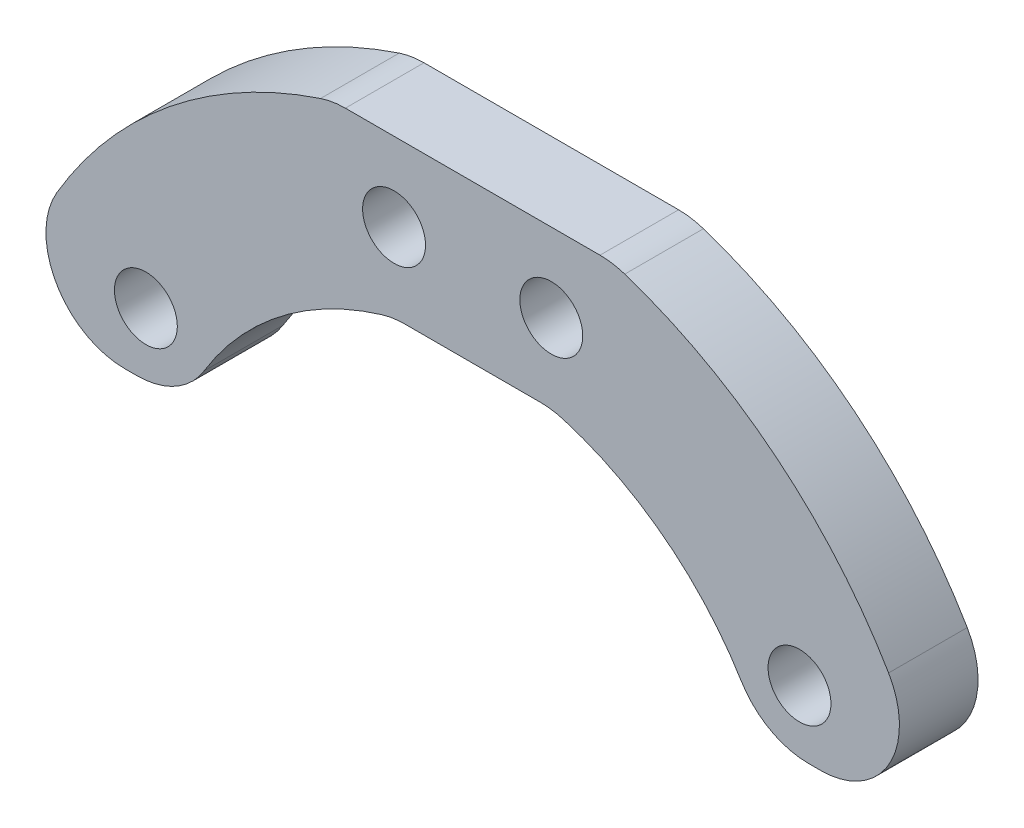
ISO-10303-21;
HEADER;
FILE_DESCRIPTION(('STEP AP214'),'2;1');
FILE_NAME('part.step','',(''),(''),'','','');
FILE_SCHEMA(('AUTOMOTIVE_DESIGN { 1 0 10303 214 1 1 1 1 }'));
ENDSEC;
DATA;
#1=APPLICATION_CONTEXT('core data for automotive mechanical design processes');
#2=APPLICATION_PROTOCOL_DEFINITION('international standard','automotive_design',2000,#1);
#3=PRODUCT_CONTEXT('',#1,'mechanical');
#4=PRODUCT('Part','Part','',(#3));
#5=PRODUCT_RELATED_PRODUCT_CATEGORY('part','',(#4));
#6=PRODUCT_DEFINITION_FORMATION('','',#4);
#7=PRODUCT_DEFINITION_CONTEXT('part definition',#1,'design');
#8=PRODUCT_DEFINITION('design','',#6,#7);
#9=PRODUCT_DEFINITION_SHAPE('','',#8);
#10=(LENGTH_UNIT() NAMED_UNIT(*) SI_UNIT(.MILLI.,.METRE.));
#11=(NAMED_UNIT(*) PLANE_ANGLE_UNIT() SI_UNIT($,.RADIAN.));
#12=(NAMED_UNIT(*) SI_UNIT($,.STERADIAN.) SOLID_ANGLE_UNIT());
#13=UNCERTAINTY_MEASURE_WITH_UNIT(LENGTH_MEASURE(1.E-05),#10,'distance_accuracy_value','');
#14=(GEOMETRIC_REPRESENTATION_CONTEXT(3) GLOBAL_UNCERTAINTY_ASSIGNED_CONTEXT((#13)) GLOBAL_UNIT_ASSIGNED_CONTEXT((#10,
#11,#12)) REPRESENTATION_CONTEXT('',''));
#15=CARTESIAN_POINT('',(0.,0.,0.));
#16=DIRECTION('',(0.,0.,1.));
#17=DIRECTION('',(1.,0.,0.));
#18=AXIS2_PLACEMENT_3D('',#15,#16,#17);
#19=CARTESIAN_POINT('',(0.,0.,5.));
#20=DIRECTION('',(0.,0.,1.));
#21=DIRECTION('',(1.,0.,0.));
#22=AXIS2_PLACEMENT_3D('',#19,#20,#21);
#23=PLANE('',#22);
#24=CARTESIAN_POINT('',(-5.,24.3649167310371,5.));
#25=DIRECTION('',(0.,0.,1.));
#26=DIRECTION('',(1.,0.,0.));
#27=AXIS2_PLACEMENT_3D('',#24,#25,#26);
#28=CIRCLE('',#27,2.00000000000001);
#29=CARTESIAN_POINT('',(-2.99999999999999,24.3649167310371,5.));
#30=VERTEX_POINT('',#29);
#31=EDGE_CURVE('E346',#30,#30,#28,.T.);
#32=ORIENTED_EDGE('',*,*,#31,.F.);
#33=EDGE_LOOP('',(#32));
#34=FACE_BOUND('',#33,.T.);
#35=CARTESIAN_POINT('',(20.7846096908266,12.,5.));
#36=DIRECTION('',(0.,0.,1.));
#37=DIRECTION('',(1.,0.,0.));
#38=AXIS2_PLACEMENT_3D('',#35,#36,#37);
#39=CIRCLE('',#38,2.00000000000001);
#40=CARTESIAN_POINT('',(22.7846096908266,12.,5.));
#41=VERTEX_POINT('',#40);
#42=EDGE_CURVE('E199',#41,#41,#39,.T.);
#43=ORIENTED_EDGE('',*,*,#42,.F.);
#44=EDGE_LOOP('',(#43));
#45=FACE_BOUND('',#44,.T.);
#46=DIRECTION('',(1.,0.,0.));
#47=VECTOR('',#46,1.);
#48=CARTESIAN_POINT('',(18.3303027798234,8.,5.));
#49=LINE('',#48,#47);
#50=CARTESIAN_POINT('',(21.3541565040626,8.,5.));
#51=VERTEX_POINT('',#50);
#52=CARTESIAN_POINT('',(22.1405877293264,8.,5.));
#53=VERTEX_POINT('',#52);
#54=EDGE_CURVE('E319',#51,#53,#49,.T.);
#55=ORIENTED_EDGE('',*,*,#54,.T.);
#56=CARTESIAN_POINT('',(22.1405877293264,13.,5.));
#57=DIRECTION('',(0.,0.,1.));
#58=DIRECTION('',(1.,0.,0.));
#59=AXIS2_PLACEMENT_3D('',#56,#57,#58);
#60=CIRCLE('',#59,5.);
#61=CARTESIAN_POINT('',(26.4522893319216,15.5316455696203,5.));
#62=VERTEX_POINT('',#61);
#63=EDGE_CURVE('E283',#53,#62,#60,.T.);
#64=ORIENTED_EDGE('',*,*,#63,.T.);
#65=CARTESIAN_POINT('',(0.,0.,5.));
#66=DIRECTION('',(0.,0.,1.));
#67=DIRECTION('',(1.,0.,0.));
#68=AXIS2_PLACEMENT_3D('',#65,#66,#67);
#69=CIRCLE('',#68,30.675);
#70=CARTESIAN_POINT('',(9.67346040706455,29.1097885384445,5.));
#71=VERTEX_POINT('',#70);
#72=EDGE_CURVE('E315',#62,#71,#69,.T.);
#73=ORIENTED_EDGE('',*,*,#72,.T.);
#74=CARTESIAN_POINT('',(8.09669424454384,24.3649167310371,5.));
#75=DIRECTION('',(0.,0.,1.));
#76=DIRECTION('',(1.,0.,0.));
#77=AXIS2_PLACEMENT_3D('',#74,#75,#76);
#78=CIRCLE('',#77,5.);
#79=CARTESIAN_POINT('',(8.09669424454384,29.3649167310371,5.));
#80=VERTEX_POINT('',#79);
#81=EDGE_CURVE('E269',#71,#80,#78,.T.);
#82=ORIENTED_EDGE('',*,*,#81,.T.);
#83=DIRECTION('',(-1.,0.,0.));
#84=VECTOR('',#83,1.);
#85=CARTESIAN_POINT('',(8.86889454099319,29.3649167310371,5.));
#86=LINE('',#85,#84);
#87=CARTESIAN_POINT('',(-8.09669424454384,29.3649167310371,5.));
#88=VERTEX_POINT('',#87);
#89=EDGE_CURVE('E311',#80,#88,#86,.T.);
#90=ORIENTED_EDGE('',*,*,#89,.T.);
#91=CARTESIAN_POINT('',(-8.09669424454384,24.3649167310371,5.));
#92=DIRECTION('',(0.,0.,1.));
#93=DIRECTION('',(1.,0.,0.));
#94=AXIS2_PLACEMENT_3D('',#91,#92,#93);
#95=CIRCLE('',#94,5.);
#96=CARTESIAN_POINT('',(-9.67346040706455,29.1097885384445,5.));
#97=VERTEX_POINT('',#96);
#98=EDGE_CURVE('E272',#88,#97,#95,.T.);
#99=ORIENTED_EDGE('',*,*,#98,.T.);
#100=CARTESIAN_POINT('',(0.,0.,5.));
#101=DIRECTION('',(0.,0.,1.));
#102=DIRECTION('',(1.,0.,0.));
#103=AXIS2_PLACEMENT_3D('',#100,#101,#102);
#104=CIRCLE('',#103,30.675);
#105=CARTESIAN_POINT('',(-26.4522893319216,15.5316455696203,5.));
#106=VERTEX_POINT('',#105);
#107=EDGE_CURVE('E309',#97,#106,#104,.T.);
#108=ORIENTED_EDGE('',*,*,#107,.T.);
#109=CARTESIAN_POINT('',(-22.1405877293264,13.,5.));
#110=DIRECTION('',(0.,0.,1.));
#111=DIRECTION('',(1.,0.,0.));
#112=AXIS2_PLACEMENT_3D('',#109,#110,#111);
#113=CIRCLE('',#112,5.);
#114=CARTESIAN_POINT('',(-22.1405877293264,8.,5.));
#115=VERTEX_POINT('',#114);
#116=EDGE_CURVE('E68',#106,#115,#113,.T.);
#117=ORIENTED_EDGE('',*,*,#116,.T.);
#118=DIRECTION('',(1.,0.,0.));
#119=VECTOR('',#118,1.);
#120=CARTESIAN_POINT('',(-29.6134365618042,8.,5.));
#121=LINE('',#120,#119);
#122=CARTESIAN_POINT('',(-21.3541565040626,8.,5.));
#123=VERTEX_POINT('',#122);
#124=EDGE_CURVE('E223',#115,#123,#121,.T.);
#125=ORIENTED_EDGE('',*,*,#124,.T.);
#126=CARTESIAN_POINT('',(-21.3541565040626,13.,5.));
#127=DIRECTION('',(0.,0.,1.));
#128=DIRECTION('',(1.,0.,0.));
#129=AXIS2_PLACEMENT_3D('',#126,#127,#128);
#130=CIRCLE('',#129,5.);
#131=CARTESIAN_POINT('',(-17.0833252032501,10.4,5.));
#132=VERTEX_POINT('',#131);
#133=EDGE_CURVE('E275',#123,#132,#130,.T.);
#134=ORIENTED_EDGE('',*,*,#133,.T.);
#135=CARTESIAN_POINT('',(0.,0.,5.));
#136=DIRECTION('',(0.,0.,-1.));
#137=DIRECTION('',(1.,0.,0.));
#138=AXIS2_PLACEMENT_3D('',#135,#136,#137);
#139=CIRCLE('',#138,20.);
#140=CARTESIAN_POINT('',(-5.75795755615106,19.1532223080494,5.));
#141=VERTEX_POINT('',#140);
#142=EDGE_CURVE('E221',#132,#141,#139,.T.);
#143=ORIENTED_EDGE('',*,*,#142,.T.);
#144=CARTESIAN_POINT('',(-4.31846816711329,14.3649167310371,5.));
#145=DIRECTION('',(0.,0.,1.));
#146=DIRECTION('',(1.,0.,0.));
#147=AXIS2_PLACEMENT_3D('',#144,#145,#146);
#148=CIRCLE('',#147,5.);
#149=CARTESIAN_POINT('',(-4.31846816711329,19.3649167310371,5.));
#150=VERTEX_POINT('',#149);
#151=EDGE_CURVE('E171',#141,#150,#148,.F.);
#152=ORIENTED_EDGE('',*,*,#151,.T.);
#153=DIRECTION('',(1.,0.,0.));
#154=VECTOR('',#153,1.);
#155=CARTESIAN_POINT('',(-5.,19.3649167310371,5.));
#156=LINE('',#155,#154);
#157=CARTESIAN_POINT('',(4.31846816711329,19.3649167310371,5.));
#158=VERTEX_POINT('',#157);
#159=EDGE_CURVE('E181',#150,#158,#156,.T.);
#160=ORIENTED_EDGE('',*,*,#159,.T.);
#161=CARTESIAN_POINT('',(4.31846816711329,14.3649167310371,5.));
#162=DIRECTION('',(0.,0.,1.));
#163=DIRECTION('',(1.,0.,0.));
#164=AXIS2_PLACEMENT_3D('',#161,#162,#163);
#165=CIRCLE('',#164,5.);
#166=CARTESIAN_POINT('',(5.75795755615106,19.1532223080494,5.));
#167=VERTEX_POINT('',#166);
#168=EDGE_CURVE('E11',#158,#167,#165,.F.);
#169=ORIENTED_EDGE('',*,*,#168,.T.);
#170=CARTESIAN_POINT('',(0.,0.,5.));
#171=DIRECTION('',(0.,0.,-1.));
#172=DIRECTION('',(1.,0.,0.));
#173=AXIS2_PLACEMENT_3D('',#170,#171,#172);
#174=CIRCLE('',#173,20.);
#175=CARTESIAN_POINT('',(17.0833252032501,10.4,5.));
#176=VERTEX_POINT('',#175);
#177=EDGE_CURVE('E323',#167,#176,#174,.T.);
#178=ORIENTED_EDGE('',*,*,#177,.T.);
#179=CARTESIAN_POINT('',(21.3541565040626,13.,5.));
#180=DIRECTION('',(0.,0.,1.));
#181=DIRECTION('',(1.,0.,0.));
#182=AXIS2_PLACEMENT_3D('',#179,#180,#181);
#183=CIRCLE('',#182,5.);
#184=EDGE_CURVE('E280',#176,#51,#183,.T.);
#185=ORIENTED_EDGE('',*,*,#184,.T.);
#186=EDGE_LOOP('',(#55,#64,#73,#82,#90,#99,#108,#117,#125,#134,#143,#152,#160,#169,#178,#185));
#187=FACE_BOUND('',#186,.T.);
#188=CARTESIAN_POINT('',(-20.7846096908264,12.0000000000002,5.));
#189=DIRECTION('',(0.,0.,1.));
#190=DIRECTION('',(1.,0.,0.));
#191=AXIS2_PLACEMENT_3D('',#188,#189,#190);
#192=CIRCLE('',#191,2.00000000000001);
#193=CARTESIAN_POINT('',(-18.7846096908264,12.0000000000002,5.));
#194=VERTEX_POINT('',#193);
#195=EDGE_CURVE('E338',#194,#194,#192,.T.);
#196=ORIENTED_EDGE('',*,*,#195,.F.);
#197=EDGE_LOOP('',(#196));
#198=FACE_BOUND('',#197,.T.);
#199=CARTESIAN_POINT('',(5.,24.3649167310371,5.));
#200=DIRECTION('',(0.,0.,1.));
#201=DIRECTION('',(-1.,0.,0.));
#202=AXIS2_PLACEMENT_3D('',#199,#200,#201);
#203=CIRCLE('',#202,2.);
#204=CARTESIAN_POINT('',(3.,24.3649167310371,5.));
#205=VERTEX_POINT('',#204);
#206=EDGE_CURVE('E354',#205,#205,#203,.T.);
#207=ORIENTED_EDGE('',*,*,#206,.F.);
#208=EDGE_LOOP('',(#207));
#209=FACE_BOUND('',#208,.T.);
#210=ADVANCED_FACE('F45',(#34,#45,#187,#198,#209),#23,.T.);
#211=CARTESIAN_POINT('',(0.,0.,0.));
#212=DIRECTION('',(0.,0.,1.));
#213=DIRECTION('',(1.,0.,0.));
#214=AXIS2_PLACEMENT_3D('',#211,#212,#213);
#215=PLANE('',#214);
#216=CARTESIAN_POINT('',(0.,0.,0.));
#217=DIRECTION('',(0.,0.,1.));
#218=DIRECTION('',(1.,0.,0.));
#219=AXIS2_PLACEMENT_3D('',#216,#217,#218);
#220=CIRCLE('',#219,30.675);
#221=CARTESIAN_POINT('',(26.4522893319216,15.5316455696203,0.));
#222=VERTEX_POINT('',#221);
#223=CARTESIAN_POINT('',(9.67346040706455,29.1097885384445,0.));
#224=VERTEX_POINT('',#223);
#225=EDGE_CURVE('E206',#222,#224,#220,.T.);
#226=ORIENTED_EDGE('',*,*,#225,.F.);
#227=CARTESIAN_POINT('',(22.1405877293264,13.,0.));
#228=DIRECTION('',(0.,0.,1.));
#229=DIRECTION('',(1.,0.,0.));
#230=AXIS2_PLACEMENT_3D('',#227,#228,#229);
#231=CIRCLE('',#230,5.);
#232=CARTESIAN_POINT('',(22.1405877293264,8.,0.));
#233=VERTEX_POINT('',#232);
#234=EDGE_CURVE('E259',#222,#233,#231,.F.);
#235=ORIENTED_EDGE('',*,*,#234,.T.);
#236=DIRECTION('',(1.,0.,0.));
#237=VECTOR('',#236,1.);
#238=CARTESIAN_POINT('',(18.3303027798234,8.,0.));
#239=LINE('',#238,#237);
#240=CARTESIAN_POINT('',(21.3541565040626,8.,0.));
#241=VERTEX_POINT('',#240);
#242=EDGE_CURVE('E197',#241,#233,#239,.T.);
#243=ORIENTED_EDGE('',*,*,#242,.F.);
#244=CARTESIAN_POINT('',(21.3541565040626,13.,0.));
#245=DIRECTION('',(0.,0.,1.));
#246=DIRECTION('',(1.,0.,0.));
#247=AXIS2_PLACEMENT_3D('',#244,#245,#246);
#248=CIRCLE('',#247,5.);
#249=CARTESIAN_POINT('',(17.0833252032501,10.4,0.));
#250=VERTEX_POINT('',#249);
#251=EDGE_CURVE('E256',#241,#250,#248,.F.);
#252=ORIENTED_EDGE('',*,*,#251,.T.);
#253=CARTESIAN_POINT('',(0.,0.,0.));
#254=DIRECTION('',(0.,0.,-1.));
#255=DIRECTION('',(1.,0.,0.));
#256=AXIS2_PLACEMENT_3D('',#253,#254,#255);
#257=CIRCLE('',#256,20.);
#258=CARTESIAN_POINT('',(5.75795755615106,19.1532223080494,0.));
#259=VERTEX_POINT('',#258);
#260=EDGE_CURVE('E191',#259,#250,#257,.T.);
#261=ORIENTED_EDGE('',*,*,#260,.F.);
#262=CARTESIAN_POINT('',(4.31846816711329,14.3649167310371,0.));
#263=DIRECTION('',(0.,0.,1.));
#264=DIRECTION('',(1.,0.,0.));
#265=AXIS2_PLACEMENT_3D('',#262,#263,#264);
#266=CIRCLE('',#265,5.);
#267=CARTESIAN_POINT('',(4.31846816711329,19.3649167310371,0.));
#268=VERTEX_POINT('',#267);
#269=EDGE_CURVE('E54',#259,#268,#266,.T.);
#270=ORIENTED_EDGE('',*,*,#269,.T.);
#271=DIRECTION('',(1.,0.,0.));
#272=VECTOR('',#271,1.);
#273=CARTESIAN_POINT('',(-5.,19.3649167310371,0.));
#274=LINE('',#273,#272);
#275=CARTESIAN_POINT('',(-4.31846816711329,19.3649167310371,0.));
#276=VERTEX_POINT('',#275);
#277=EDGE_CURVE('E178',#276,#268,#274,.T.);
#278=ORIENTED_EDGE('',*,*,#277,.F.);
#279=CARTESIAN_POINT('',(-4.31846816711329,14.3649167310371,0.));
#280=DIRECTION('',(0.,0.,1.));
#281=DIRECTION('',(1.,0.,0.));
#282=AXIS2_PLACEMENT_3D('',#279,#280,#281);
#283=CIRCLE('',#282,5.);
#284=CARTESIAN_POINT('',(-5.75795755615106,19.1532223080494,0.));
#285=VERTEX_POINT('',#284);
#286=EDGE_CURVE('E160',#276,#285,#283,.T.);
#287=ORIENTED_EDGE('',*,*,#286,.T.);
#288=CARTESIAN_POINT('',(0.,0.,0.));
#289=DIRECTION('',(0.,0.,-1.));
#290=DIRECTION('',(1.,0.,0.));
#291=AXIS2_PLACEMENT_3D('',#288,#289,#290);
#292=CIRCLE('',#291,20.);
#293=CARTESIAN_POINT('',(-17.0833252032501,10.4,0.));
#294=VERTEX_POINT('',#293);
#295=EDGE_CURVE('E192',#294,#285,#292,.T.);
#296=ORIENTED_EDGE('',*,*,#295,.F.);
#297=CARTESIAN_POINT('',(-21.3541565040626,13.,0.));
#298=DIRECTION('',(0.,0.,1.));
#299=DIRECTION('',(1.,0.,0.));
#300=AXIS2_PLACEMENT_3D('',#297,#298,#299);
#301=CIRCLE('',#300,5.);
#302=CARTESIAN_POINT('',(-21.3541565040626,8.,0.));
#303=VERTEX_POINT('',#302);
#304=EDGE_CURVE('E250',#294,#303,#301,.F.);
#305=ORIENTED_EDGE('',*,*,#304,.T.);
#306=DIRECTION('',(1.,0.,0.));
#307=VECTOR('',#306,1.);
#308=CARTESIAN_POINT('',(-29.6134365618042,8.,0.));
#309=LINE('',#308,#307);
#310=CARTESIAN_POINT('',(-22.1405877293264,8.,0.));
#311=VERTEX_POINT('',#310);
#312=EDGE_CURVE('E218',#311,#303,#309,.T.);
#313=ORIENTED_EDGE('',*,*,#312,.F.);
#314=CARTESIAN_POINT('',(-22.1405877293264,13.,0.));
#315=DIRECTION('',(0.,0.,1.));
#316=DIRECTION('',(1.,0.,0.));
#317=AXIS2_PLACEMENT_3D('',#314,#315,#316);
#318=CIRCLE('',#317,5.);
#319=CARTESIAN_POINT('',(-26.4522893319216,15.5316455696203,0.));
#320=VERTEX_POINT('',#319);
#321=EDGE_CURVE('E253',#311,#320,#318,.F.);
#322=ORIENTED_EDGE('',*,*,#321,.T.);
#323=CARTESIAN_POINT('',(0.,0.,0.));
#324=DIRECTION('',(0.,0.,1.));
#325=DIRECTION('',(1.,0.,0.));
#326=AXIS2_PLACEMENT_3D('',#323,#324,#325);
#327=CIRCLE('',#326,30.675);
#328=CARTESIAN_POINT('',(-9.67346040706455,29.1097885384445,0.));
#329=VERTEX_POINT('',#328);
#330=EDGE_CURVE('E214',#329,#320,#327,.T.);
#331=ORIENTED_EDGE('',*,*,#330,.F.);
#332=CARTESIAN_POINT('',(-8.09669424454384,24.3649167310371,0.));
#333=DIRECTION('',(0.,0.,1.));
#334=DIRECTION('',(1.,0.,0.));
#335=AXIS2_PLACEMENT_3D('',#332,#333,#334);
#336=CIRCLE('',#335,5.);
#337=CARTESIAN_POINT('',(-8.09669424454384,29.3649167310371,0.));
#338=VERTEX_POINT('',#337);
#339=EDGE_CURVE('E247',#329,#338,#336,.F.);
#340=ORIENTED_EDGE('',*,*,#339,.T.);
#341=DIRECTION('',(-1.,0.,0.));
#342=VECTOR('',#341,1.);
#343=CARTESIAN_POINT('',(8.86889454099319,29.3649167310371,0.));
#344=LINE('',#343,#342);
#345=CARTESIAN_POINT('',(8.09669424454384,29.3649167310371,0.));
#346=VERTEX_POINT('',#345);
#347=EDGE_CURVE('E210',#346,#338,#344,.T.);
#348=ORIENTED_EDGE('',*,*,#347,.F.);
#349=CARTESIAN_POINT('',(8.09669424454384,24.3649167310371,0.));
#350=DIRECTION('',(0.,0.,1.));
#351=DIRECTION('',(1.,0.,0.));
#352=AXIS2_PLACEMENT_3D('',#349,#350,#351);
#353=CIRCLE('',#352,5.);
#354=EDGE_CURVE('E244',#346,#224,#353,.F.);
#355=ORIENTED_EDGE('',*,*,#354,.T.);
#356=EDGE_LOOP('',(#226,#235,#243,#252,#261,#270,#278,#287,#296,#305,#313,#322,#331,#340,#348,#355));
#357=FACE_BOUND('',#356,.T.);
#358=CARTESIAN_POINT('',(20.7846096908266,12.,0.));
#359=DIRECTION('',(0.,0.,1.));
#360=DIRECTION('',(1.,0.,0.));
#361=AXIS2_PLACEMENT_3D('',#358,#359,#360);
#362=CIRCLE('',#361,2.00000000000001);
#363=CARTESIAN_POINT('',(22.7846096908266,12.,0.));
#364=VERTEX_POINT('',#363);
#365=EDGE_CURVE('E334',#364,#364,#362,.T.);
#366=ORIENTED_EDGE('',*,*,#365,.T.);
#367=EDGE_LOOP('',(#366));
#368=FACE_BOUND('',#367,.T.);
#369=CARTESIAN_POINT('',(-20.7846096908264,12.0000000000002,0.));
#370=DIRECTION('',(0.,0.,1.));
#371=DIRECTION('',(1.,0.,0.));
#372=AXIS2_PLACEMENT_3D('',#369,#370,#371);
#373=CIRCLE('',#372,2.00000000000001);
#374=CARTESIAN_POINT('',(-18.7846096908264,12.0000000000002,0.));
#375=VERTEX_POINT('',#374);
#376=EDGE_CURVE('E342',#375,#375,#373,.T.);
#377=ORIENTED_EDGE('',*,*,#376,.T.);
#378=EDGE_LOOP('',(#377));
#379=FACE_BOUND('',#378,.T.);
#380=CARTESIAN_POINT('',(-5.,24.3649167310371,0.));
#381=DIRECTION('',(0.,0.,1.));
#382=DIRECTION('',(1.,0.,0.));
#383=AXIS2_PLACEMENT_3D('',#380,#381,#382);
#384=CIRCLE('',#383,2.00000000000001);
#385=CARTESIAN_POINT('',(-2.99999999999999,24.3649167310371,0.));
#386=VERTEX_POINT('',#385);
#387=EDGE_CURVE('E350',#386,#386,#384,.T.);
#388=ORIENTED_EDGE('',*,*,#387,.T.);
#389=EDGE_LOOP('',(#388));
#390=FACE_BOUND('',#389,.T.);
#391=CARTESIAN_POINT('',(5.,24.3649167310371,0.));
#392=DIRECTION('',(0.,0.,1.));
#393=DIRECTION('',(-1.,0.,0.));
#394=AXIS2_PLACEMENT_3D('',#391,#392,#393);
#395=CIRCLE('',#394,2.);
#396=CARTESIAN_POINT('',(3.,24.3649167310371,0.));
#397=VERTEX_POINT('',#396);
#398=EDGE_CURVE('E358',#397,#397,#395,.T.);
#399=ORIENTED_EDGE('',*,*,#398,.T.);
#400=EDGE_LOOP('',(#399));
#401=FACE_BOUND('',#400,.T.);
#402=ADVANCED_FACE('F187',(#357,#368,#379,#390,#401),#215,.F.);
#403=CARTESIAN_POINT('',(0.,0.,5.));
#404=DIRECTION('',(0.,0.,-1.));
#405=DIRECTION('',(-1.,0.,0.));
#406=AXIS2_PLACEMENT_3D('',#403,#404,#405);
#407=CYLINDRICAL_SURFACE('',#406,20.);
#408=ORIENTED_EDGE('',*,*,#295,.T.);
#409=DIRECTION('',(0.,0.,-1.));
#410=VECTOR('',#409,1.);
#411=CARTESIAN_POINT('',(-5.75795755615106,19.1532223080494,5.));
#412=LINE('',#411,#410);
#413=EDGE_CURVE('E165',#285,#141,#412,.F.);
#414=ORIENTED_EDGE('',*,*,#413,.T.);
#415=ORIENTED_EDGE('',*,*,#142,.F.);
#416=DIRECTION('',(0.,0.,-1.));
#417=VECTOR('',#416,1.);
#418=CARTESIAN_POINT('',(-17.0833252032501,10.4,5.));
#419=LINE('',#418,#417);
#420=EDGE_CURVE('E183',#132,#294,#419,.T.);
#421=ORIENTED_EDGE('',*,*,#420,.T.);
#422=EDGE_LOOP('',(#408,#414,#415,#421));
#423=FACE_BOUND('',#422,.T.);
#424=ADVANCED_FACE('F376',(#423),#407,.F.);
#425=CARTESIAN_POINT('',(-5.,19.3649167310371,5.));
#426=DIRECTION('',(0.,1.,0.));
#427=DIRECTION('',(0.,0.,1.));
#428=AXIS2_PLACEMENT_3D('',#425,#426,#427);
#429=PLANE('',#428);
#430=ORIENTED_EDGE('',*,*,#159,.F.);
#431=DIRECTION('',(0.,0.,1.));
#432=VECTOR('',#431,1.);
#433=CARTESIAN_POINT('',(-4.31846816711329,19.3649167310371,0.));
#434=LINE('',#433,#432);
#435=EDGE_CURVE('E164',#150,#276,#434,.F.);
#436=ORIENTED_EDGE('',*,*,#435,.T.);
#437=ORIENTED_EDGE('',*,*,#277,.T.);
#438=DIRECTION('',(0.,0.,1.));
#439=VECTOR('',#438,1.);
#440=CARTESIAN_POINT('',(4.31846816711329,19.3649167310371,5.));
#441=LINE('',#440,#439);
#442=EDGE_CURVE('E184',#268,#158,#441,.T.);
#443=ORIENTED_EDGE('',*,*,#442,.T.);
#444=EDGE_LOOP('',(#430,#436,#437,#443));
#445=FACE_BOUND('',#444,.T.);
#446=ADVANCED_FACE('F177',(#445),#429,.F.);
#447=CARTESIAN_POINT('',(0.,0.,5.));
#448=DIRECTION('',(0.,0.,-1.));
#449=DIRECTION('',(-1.,0.,0.));
#450=AXIS2_PLACEMENT_3D('',#447,#448,#449);
#451=CYLINDRICAL_SURFACE('',#450,20.);
#452=ORIENTED_EDGE('',*,*,#177,.F.);
#453=DIRECTION('',(0.,0.,-1.));
#454=VECTOR('',#453,1.);
#455=CARTESIAN_POINT('',(5.75795755615106,19.1532223080494,5.));
#456=LINE('',#455,#454);
#457=EDGE_CURVE('E233',#167,#259,#456,.T.);
#458=ORIENTED_EDGE('',*,*,#457,.T.);
#459=ORIENTED_EDGE('',*,*,#260,.T.);
#460=DIRECTION('',(0.,0.,-1.));
#461=VECTOR('',#460,1.);
#462=CARTESIAN_POINT('',(17.0833252032501,10.4,5.));
#463=LINE('',#462,#461);
#464=EDGE_CURVE('E230',#250,#176,#463,.F.);
#465=ORIENTED_EDGE('',*,*,#464,.T.);
#466=EDGE_LOOP('',(#452,#458,#459,#465));
#467=FACE_BOUND('',#466,.T.);
#468=ADVANCED_FACE('F402',(#467),#451,.F.);
#469=CARTESIAN_POINT('',(18.3303027798234,8.,5.));
#470=DIRECTION('',(0.,1.,0.));
#471=DIRECTION('',(0.,0.,1.));
#472=AXIS2_PLACEMENT_3D('',#469,#470,#471);
#473=PLANE('',#472);
#474=ORIENTED_EDGE('',*,*,#242,.T.);
#475=DIRECTION('',(0.,0.,-1.));
#476=VECTOR('',#475,1.);
#477=CARTESIAN_POINT('',(22.1405877293264,8.,5.));
#478=LINE('',#477,#476);
#479=EDGE_CURVE('E266',#233,#53,#478,.F.);
#480=ORIENTED_EDGE('',*,*,#479,.T.);
#481=ORIENTED_EDGE('',*,*,#54,.F.);
#482=DIRECTION('',(0.,0.,-1.));
#483=VECTOR('',#482,1.);
#484=CARTESIAN_POINT('',(21.3541565040626,8.,5.));
#485=LINE('',#484,#483);
#486=EDGE_CURVE('E262',#51,#241,#485,.T.);
#487=ORIENTED_EDGE('',*,*,#486,.T.);
#488=EDGE_LOOP('',(#474,#480,#481,#487));
#489=FACE_BOUND('',#488,.T.);
#490=ADVANCED_FACE('F398',(#489),#473,.F.);
#491=CARTESIAN_POINT('',(0.,0.,5.));
#492=DIRECTION('',(0.,0.,-1.));
#493=DIRECTION('',(-1.,0.,0.));
#494=AXIS2_PLACEMENT_3D('',#491,#492,#493);
#495=CYLINDRICAL_SURFACE('',#494,30.675);
#496=ORIENTED_EDGE('',*,*,#72,.F.);
#497=DIRECTION('',(0.,0.,-1.));
#498=VECTOR('',#497,1.);
#499=CARTESIAN_POINT('',(26.4522893319216,15.5316455696203,5.));
#500=LINE('',#499,#498);
#501=EDGE_CURVE('E240',#62,#222,#500,.T.);
#502=ORIENTED_EDGE('',*,*,#501,.T.);
#503=ORIENTED_EDGE('',*,*,#225,.T.);
#504=DIRECTION('',(0.,0.,-1.));
#505=VECTOR('',#504,1.);
#506=CARTESIAN_POINT('',(9.67346040706455,29.1097885384445,5.));
#507=LINE('',#506,#505);
#508=EDGE_CURVE('E237',#224,#71,#507,.F.);
#509=ORIENTED_EDGE('',*,*,#508,.T.);
#510=EDGE_LOOP('',(#496,#502,#503,#509));
#511=FACE_BOUND('',#510,.T.);
#512=ADVANCED_FACE('F394',(#511),#495,.T.);
#513=CARTESIAN_POINT('',(8.86889454099319,29.3649167310371,5.));
#514=DIRECTION('',(0.,-1.,0.));
#515=DIRECTION('',(0.,0.,-1.));
#516=AXIS2_PLACEMENT_3D('',#513,#514,#515);
#517=PLANE('',#516);
#518=ORIENTED_EDGE('',*,*,#347,.T.);
#519=DIRECTION('',(0.,0.,-1.));
#520=VECTOR('',#519,1.);
#521=CARTESIAN_POINT('',(-8.09669424454384,29.3649167310371,5.));
#522=LINE('',#521,#520);
#523=EDGE_CURVE('E172',#338,#88,#522,.F.);
#524=ORIENTED_EDGE('',*,*,#523,.T.);
#525=ORIENTED_EDGE('',*,*,#89,.F.);
#526=DIRECTION('',(0.,0.,-1.));
#527=VECTOR('',#526,1.);
#528=CARTESIAN_POINT('',(8.09669424454384,29.3649167310371,5.));
#529=LINE('',#528,#527);
#530=EDGE_CURVE('E299',#80,#346,#529,.T.);
#531=ORIENTED_EDGE('',*,*,#530,.T.);
#532=EDGE_LOOP('',(#518,#524,#525,#531));
#533=FACE_BOUND('',#532,.T.);
#534=ADVANCED_FACE('F390',(#533),#517,.F.);
#535=CARTESIAN_POINT('',(0.,0.,5.));
#536=DIRECTION('',(0.,0.,-1.));
#537=DIRECTION('',(-1.,0.,0.));
#538=AXIS2_PLACEMENT_3D('',#535,#536,#537);
#539=CYLINDRICAL_SURFACE('',#538,30.675);
#540=ORIENTED_EDGE('',*,*,#330,.T.);
#541=DIRECTION('',(0.,0.,-1.));
#542=VECTOR('',#541,1.);
#543=CARTESIAN_POINT('',(-26.4522893319216,15.5316455696203,5.));
#544=LINE('',#543,#542);
#545=EDGE_CURVE('E296',#320,#106,#544,.F.);
#546=ORIENTED_EDGE('',*,*,#545,.T.);
#547=ORIENTED_EDGE('',*,*,#107,.F.);
#548=DIRECTION('',(0.,0.,-1.));
#549=VECTOR('',#548,1.);
#550=CARTESIAN_POINT('',(-9.67346040706455,29.1097885384445,5.));
#551=LINE('',#550,#549);
#552=EDGE_CURVE('E292',#97,#329,#551,.T.);
#553=ORIENTED_EDGE('',*,*,#552,.T.);
#554=EDGE_LOOP('',(#540,#546,#547,#553));
#555=FACE_BOUND('',#554,.T.);
#556=ADVANCED_FACE('F387',(#555),#539,.T.);
#557=CARTESIAN_POINT('',(-29.6134365618042,8.,5.));
#558=DIRECTION('',(0.,1.,0.));
#559=DIRECTION('',(0.,0.,1.));
#560=AXIS2_PLACEMENT_3D('',#557,#558,#559);
#561=PLANE('',#560);
#562=ORIENTED_EDGE('',*,*,#124,.F.);
#563=DIRECTION('',(0.,0.,-1.));
#564=VECTOR('',#563,1.);
#565=CARTESIAN_POINT('',(-22.1405877293264,8.,5.));
#566=LINE('',#565,#564);
#567=EDGE_CURVE('E288',#115,#311,#566,.T.);
#568=ORIENTED_EDGE('',*,*,#567,.T.);
#569=ORIENTED_EDGE('',*,*,#312,.T.);
#570=DIRECTION('',(0.,0.,-1.));
#571=VECTOR('',#570,1.);
#572=CARTESIAN_POINT('',(-21.3541565040626,8.,5.));
#573=LINE('',#572,#571);
#574=EDGE_CURVE('E61',#303,#123,#573,.F.);
#575=ORIENTED_EDGE('',*,*,#574,.T.);
#576=EDGE_LOOP('',(#562,#568,#569,#575));
#577=FACE_BOUND('',#576,.T.);
#578=ADVANCED_FACE('F384',(#577),#561,.F.);
#579=CARTESIAN_POINT('',(20.7846096908266,12.,5.));
#580=DIRECTION('',(0.,0.,-1.));
#581=DIRECTION('',(-1.,0.,0.));
#582=AXIS2_PLACEMENT_3D('',#579,#580,#581);
#583=CYLINDRICAL_SURFACE('',#582,2.00000000000001);
#584=ORIENTED_EDGE('',*,*,#42,.T.);
#585=EDGE_LOOP('',(#584));
#586=FACE_BOUND('',#585,.T.);
#587=ORIENTED_EDGE('',*,*,#365,.F.);
#588=EDGE_LOOP('',(#587));
#589=FACE_BOUND('',#588,.T.);
#590=ADVANCED_FACE('F381',(#586,#589),#583,.F.);
#591=CARTESIAN_POINT('',(-20.7846096908264,12.0000000000002,5.));
#592=DIRECTION('',(0.,0.,-1.));
#593=DIRECTION('',(-1.,0.,0.));
#594=AXIS2_PLACEMENT_3D('',#591,#592,#593);
#595=CYLINDRICAL_SURFACE('',#594,2.00000000000001);
#596=ORIENTED_EDGE('',*,*,#195,.T.);
#597=EDGE_LOOP('',(#596));
#598=FACE_BOUND('',#597,.T.);
#599=ORIENTED_EDGE('',*,*,#376,.F.);
#600=EDGE_LOOP('',(#599));
#601=FACE_BOUND('',#600,.T.);
#602=ADVANCED_FACE('F470',(#598,#601),#595,.F.);
#603=CARTESIAN_POINT('',(-5.,24.3649167310371,5.));
#604=DIRECTION('',(0.,0.,-1.));
#605=DIRECTION('',(-1.,0.,0.));
#606=AXIS2_PLACEMENT_3D('',#603,#604,#605);
#607=CYLINDRICAL_SURFACE('',#606,2.00000000000001);
#608=ORIENTED_EDGE('',*,*,#31,.T.);
#609=EDGE_LOOP('',(#608));
#610=FACE_BOUND('',#609,.T.);
#611=ORIENTED_EDGE('',*,*,#387,.F.);
#612=EDGE_LOOP('',(#611));
#613=FACE_BOUND('',#612,.T.);
#614=ADVANCED_FACE('F473',(#610,#613),#607,.F.);
#615=CARTESIAN_POINT('',(5.,24.3649167310371,5.));
#616=DIRECTION('',(0.,0.,-1.));
#617=DIRECTION('',(-1.,0.,0.));
#618=AXIS2_PLACEMENT_3D('',#615,#616,#617);
#619=CYLINDRICAL_SURFACE('',#618,2.);
#620=ORIENTED_EDGE('',*,*,#206,.T.);
#621=EDGE_LOOP('',(#620));
#622=FACE_BOUND('',#621,.T.);
#623=ORIENTED_EDGE('',*,*,#398,.F.);
#624=EDGE_LOOP('',(#623));
#625=FACE_BOUND('',#624,.T.);
#626=ADVANCED_FACE('F366',(#622,#625),#619,.F.);
#627=CARTESIAN_POINT('',(-4.31846816711329,14.3649167310371,5.));
#628=DIRECTION('',(0.,0.,-1.));
#629=DIRECTION('',(-1.,0.,0.));
#630=AXIS2_PLACEMENT_3D('',#627,#628,#629);
#631=CYLINDRICAL_SURFACE('',#630,5.);
#632=ORIENTED_EDGE('',*,*,#151,.F.);
#633=ORIENTED_EDGE('',*,*,#413,.F.);
#634=ORIENTED_EDGE('',*,*,#286,.F.);
#635=ORIENTED_EDGE('',*,*,#435,.F.);
#636=EDGE_LOOP('',(#632,#633,#634,#635));
#637=FACE_BOUND('',#636,.T.);
#638=ADVANCED_FACE('F163',(#637),#631,.F.);
#639=CARTESIAN_POINT('',(4.31846816711329,14.3649167310371,5.));
#640=DIRECTION('',(0.,0.,-1.));
#641=DIRECTION('',(-1.,0.,0.));
#642=AXIS2_PLACEMENT_3D('',#639,#640,#641);
#643=CYLINDRICAL_SURFACE('',#642,5.);
#644=ORIENTED_EDGE('',*,*,#168,.F.);
#645=ORIENTED_EDGE('',*,*,#442,.F.);
#646=ORIENTED_EDGE('',*,*,#269,.F.);
#647=ORIENTED_EDGE('',*,*,#457,.F.);
#648=EDGE_LOOP('',(#644,#645,#646,#647));
#649=FACE_BOUND('',#648,.T.);
#650=ADVANCED_FACE('F414',(#649),#643,.F.);
#651=CARTESIAN_POINT('',(22.1405877293264,13.,5.));
#652=DIRECTION('',(0.,0.,-1.));
#653=DIRECTION('',(-1.,0.,0.));
#654=AXIS2_PLACEMENT_3D('',#651,#652,#653);
#655=CYLINDRICAL_SURFACE('',#654,5.);
#656=ORIENTED_EDGE('',*,*,#63,.F.);
#657=ORIENTED_EDGE('',*,*,#479,.F.);
#658=ORIENTED_EDGE('',*,*,#234,.F.);
#659=ORIENTED_EDGE('',*,*,#501,.F.);
#660=EDGE_LOOP('',(#656,#657,#658,#659));
#661=FACE_BOUND('',#660,.T.);
#662=ADVANCED_FACE('F417',(#661),#655,.T.);
#663=CARTESIAN_POINT('',(21.3541565040626,13.,5.));
#664=DIRECTION('',(0.,0.,-1.));
#665=DIRECTION('',(-1.,0.,0.));
#666=AXIS2_PLACEMENT_3D('',#663,#664,#665);
#667=CYLINDRICAL_SURFACE('',#666,5.);
#668=ORIENTED_EDGE('',*,*,#184,.F.);
#669=ORIENTED_EDGE('',*,*,#464,.F.);
#670=ORIENTED_EDGE('',*,*,#251,.F.);
#671=ORIENTED_EDGE('',*,*,#486,.F.);
#672=EDGE_LOOP('',(#668,#669,#670,#671));
#673=FACE_BOUND('',#672,.T.);
#674=ADVANCED_FACE('F421',(#673),#667,.T.);
#675=CARTESIAN_POINT('',(-22.1405877293264,13.,5.));
#676=DIRECTION('',(0.,0.,-1.));
#677=DIRECTION('',(-1.,0.,0.));
#678=AXIS2_PLACEMENT_3D('',#675,#676,#677);
#679=CYLINDRICAL_SURFACE('',#678,5.);
#680=ORIENTED_EDGE('',*,*,#116,.F.);
#681=ORIENTED_EDGE('',*,*,#545,.F.);
#682=ORIENTED_EDGE('',*,*,#321,.F.);
#683=ORIENTED_EDGE('',*,*,#567,.F.);
#684=EDGE_LOOP('',(#680,#681,#682,#683));
#685=FACE_BOUND('',#684,.T.);
#686=ADVANCED_FACE('F425',(#685),#679,.T.);
#687=CARTESIAN_POINT('',(-21.3541565040626,13.,5.));
#688=DIRECTION('',(0.,0.,-1.));
#689=DIRECTION('',(-1.,0.,0.));
#690=AXIS2_PLACEMENT_3D('',#687,#688,#689);
#691=CYLINDRICAL_SURFACE('',#690,5.);
#692=ORIENTED_EDGE('',*,*,#133,.F.);
#693=ORIENTED_EDGE('',*,*,#574,.F.);
#694=ORIENTED_EDGE('',*,*,#304,.F.);
#695=ORIENTED_EDGE('',*,*,#420,.F.);
#696=EDGE_LOOP('',(#692,#693,#694,#695));
#697=FACE_BOUND('',#696,.T.);
#698=ADVANCED_FACE('F429',(#697),#691,.T.);
#699=CARTESIAN_POINT('',(-8.09669424454384,24.3649167310371,5.));
#700=DIRECTION('',(0.,0.,-1.));
#701=DIRECTION('',(-1.,0.,0.));
#702=AXIS2_PLACEMENT_3D('',#699,#700,#701);
#703=CYLINDRICAL_SURFACE('',#702,5.);
#704=ORIENTED_EDGE('',*,*,#98,.F.);
#705=ORIENTED_EDGE('',*,*,#523,.F.);
#706=ORIENTED_EDGE('',*,*,#339,.F.);
#707=ORIENTED_EDGE('',*,*,#552,.F.);
#708=EDGE_LOOP('',(#704,#705,#706,#707));
#709=FACE_BOUND('',#708,.T.);
#710=ADVANCED_FACE('F432',(#709),#703,.T.);
#711=CARTESIAN_POINT('',(8.09669424454384,24.3649167310371,5.));
#712=DIRECTION('',(0.,0.,-1.));
#713=DIRECTION('',(-1.,0.,0.));
#714=AXIS2_PLACEMENT_3D('',#711,#712,#713);
#715=CYLINDRICAL_SURFACE('',#714,5.);
#716=ORIENTED_EDGE('',*,*,#81,.F.);
#717=ORIENTED_EDGE('',*,*,#508,.F.);
#718=ORIENTED_EDGE('',*,*,#354,.F.);
#719=ORIENTED_EDGE('',*,*,#530,.F.);
#720=EDGE_LOOP('',(#716,#717,#718,#719));
#721=FACE_BOUND('',#720,.T.);
#722=ADVANCED_FACE('F47',(#721),#715,.T.);
#723=CLOSED_SHELL('',(#210,#402,#424,#446,#468,#490,#512,#534,#556,#578,#590,#602,#614,#626,
#638,#650,#662,#674,#686,#698,#710,#722));
#724=MANIFOLD_SOLID_BREP('B2',#723);
#725=ADVANCED_BREP_SHAPE_REPRESENTATION('',(#18,#724),#14);
#726=SHAPE_DEFINITION_REPRESENTATION(#9,#725);
ENDSEC;
END-ISO-10303-21;
